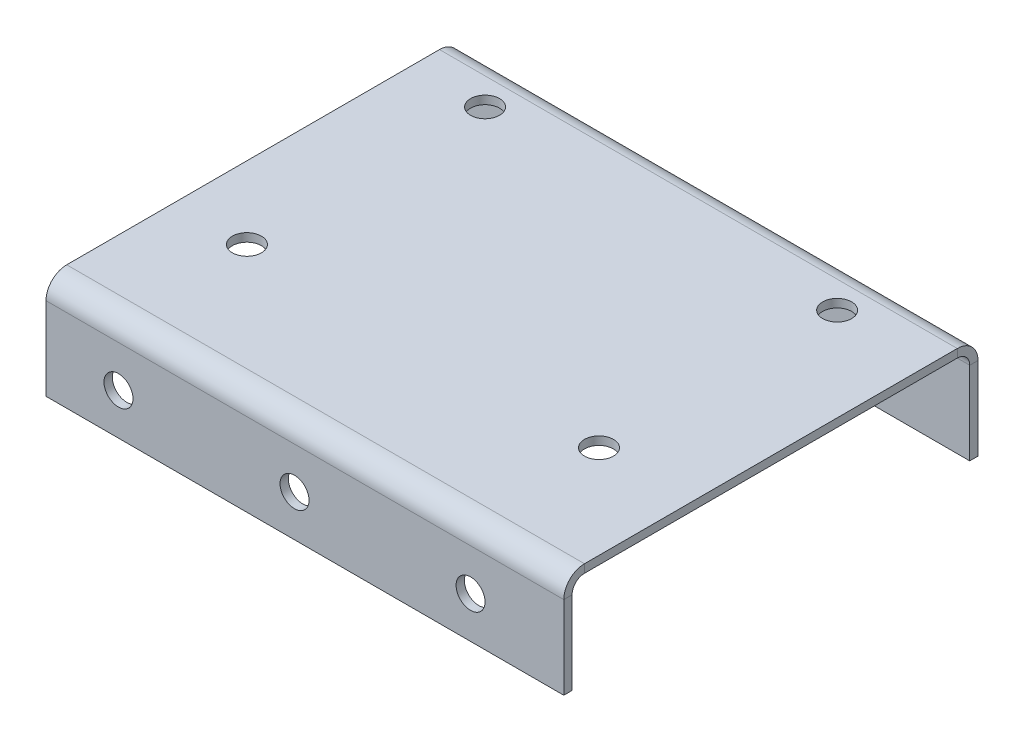
ISO-10303-21;
HEADER;
FILE_DESCRIPTION(('STEP AP214'),'2;1');
FILE_NAME('part.step','',(''),(''),'','','');
FILE_SCHEMA(('AUTOMOTIVE_DESIGN { 1 0 10303 214 1 1 1 1 }'));
ENDSEC;
DATA;
#1=APPLICATION_CONTEXT('core data for automotive mechanical design processes');
#2=APPLICATION_PROTOCOL_DEFINITION('international standard','automotive_design',2000,#1);
#3=PRODUCT_CONTEXT('',#1,'mechanical');
#4=PRODUCT('Part','Part','',(#3));
#5=PRODUCT_RELATED_PRODUCT_CATEGORY('part','',(#4));
#6=PRODUCT_DEFINITION_FORMATION('','',#4);
#7=PRODUCT_DEFINITION_CONTEXT('part definition',#1,'design');
#8=PRODUCT_DEFINITION('design','',#6,#7);
#9=PRODUCT_DEFINITION_SHAPE('','',#8);
#10=(LENGTH_UNIT() NAMED_UNIT(*) SI_UNIT(.MILLI.,.METRE.));
#11=(NAMED_UNIT(*) PLANE_ANGLE_UNIT() SI_UNIT($,.RADIAN.));
#12=(NAMED_UNIT(*) SI_UNIT($,.STERADIAN.) SOLID_ANGLE_UNIT());
#13=UNCERTAINTY_MEASURE_WITH_UNIT(LENGTH_MEASURE(1.E-05),#10,'distance_accuracy_value','');
#14=(GEOMETRIC_REPRESENTATION_CONTEXT(3) GLOBAL_UNCERTAINTY_ASSIGNED_CONTEXT((#13)) GLOBAL_UNIT_ASSIGNED_CONTEXT((#10,
#11,#12)) REPRESENTATION_CONTEXT('',''));
#15=CARTESIAN_POINT('',(0.,0.,0.));
#16=DIRECTION('',(0.,0.,1.));
#17=DIRECTION('',(1.,0.,0.));
#18=AXIS2_PLACEMENT_3D('',#15,#16,#17);
#19=CARTESIAN_POINT('',(125.,86.8114285714285,-10.));
#20=DIRECTION('',(1.,0.,0.));
#21=DIRECTION('',(0.,0.,-1.));
#22=AXIS2_PLACEMENT_3D('',#19,#20,#21);
#23=PLANE('',#22);
#24=DIRECTION('',(0.,-1.,0.));
#25=VECTOR('',#24,1.);
#26=CARTESIAN_POINT('',(125.,86.8114285714285,-10.));
#27=LINE('',#26,#25);
#28=CARTESIAN_POINT('',(125.,86.8114285714285,-10.));
#29=VERTEX_POINT('',#28);
#30=CARTESIAN_POINT('',(125.,82.8114285714285,-10.));
#31=VERTEX_POINT('',#30);
#32=EDGE_CURVE('E11',#29,#31,#27,.T.);
#33=ORIENTED_EDGE('',*,*,#32,.F.);
#34=CARTESIAN_POINT('',(125.,76.8114285714286,-10.));
#35=DIRECTION('',(1.,0.,0.));
#36=DIRECTION('',(0.,0.,-1.));
#37=AXIS2_PLACEMENT_3D('',#34,#35,#36);
#38=CIRCLE('',#37,10.);
#39=CARTESIAN_POINT('',(125.,76.8114285714286,0.));
#40=VERTEX_POINT('',#39);
#41=EDGE_CURVE('E288',#40,#29,#38,.F.);
#42=ORIENTED_EDGE('',*,*,#41,.F.);
#43=DIRECTION('',(0.,0.,1.));
#44=VECTOR('',#43,1.);
#45=CARTESIAN_POINT('',(125.,76.8114285714286,-4.));
#46=LINE('',#45,#44);
#47=CARTESIAN_POINT('',(125.,76.8114285714286,-4.));
#48=VERTEX_POINT('',#47);
#49=EDGE_CURVE('E49',#48,#40,#46,.T.);
#50=ORIENTED_EDGE('',*,*,#49,.F.);
#51=CARTESIAN_POINT('',(125.,76.8114285714286,-10.));
#52=DIRECTION('',(1.,0.,0.));
#53=DIRECTION('',(0.,0.,-1.));
#54=AXIS2_PLACEMENT_3D('',#51,#52,#53);
#55=CIRCLE('',#54,6.);
#56=EDGE_CURVE('E151',#48,#31,#55,.F.);
#57=ORIENTED_EDGE('',*,*,#56,.T.);
#58=EDGE_LOOP('',(#33,#42,#50,#57));
#59=FACE_BOUND('',#58,.T.);
#60=ADVANCED_FACE('F40',(#59),#23,.T.);
#61=CARTESIAN_POINT('',(125.,76.8114285714286,-4.));
#62=DIRECTION('',(1.,0.,0.));
#63=DIRECTION('',(0.,0.,-1.));
#64=AXIS2_PLACEMENT_3D('',#61,#62,#63);
#65=PLANE('',#64);
#66=DIRECTION('',(0.,0.,-1.));
#67=VECTOR('',#66,1.);
#68=CARTESIAN_POINT('',(125.,86.8114285714285,0.));
#69=LINE('',#68,#67);
#70=CARTESIAN_POINT('',(125.,86.8114285714285,-190.));
#71=VERTEX_POINT('',#70);
#72=EDGE_CURVE('E145',#29,#71,#69,.T.);
#73=ORIENTED_EDGE('',*,*,#72,.F.);
#74=ORIENTED_EDGE('',*,*,#32,.T.);
#75=DIRECTION('',(0.,0.,-1.));
#76=VECTOR('',#75,1.);
#77=CARTESIAN_POINT('',(125.,82.8114285714285,0.));
#78=LINE('',#77,#76);
#79=CARTESIAN_POINT('',(125.,82.8114285714286,-190.));
#80=VERTEX_POINT('',#79);
#81=EDGE_CURVE('E142',#31,#80,#78,.T.);
#82=ORIENTED_EDGE('',*,*,#81,.T.);
#83=DIRECTION('',(0.,1.,0.));
#84=VECTOR('',#83,1.);
#85=CARTESIAN_POINT('',(125.,82.8114285714286,-190.));
#86=LINE('',#85,#84);
#87=EDGE_CURVE('E234',#80,#71,#86,.T.);
#88=ORIENTED_EDGE('',*,*,#87,.T.);
#89=EDGE_LOOP('',(#73,#74,#82,#88));
#90=FACE_BOUND('',#89,.T.);
#91=ADVANCED_FACE('F140',(#90),#65,.T.);
#92=CARTESIAN_POINT('',(-125.,76.8114285714286,0.));
#93=DIRECTION('',(-1.,0.,0.));
#94=DIRECTION('',(0.,0.,1.));
#95=AXIS2_PLACEMENT_3D('',#92,#93,#94);
#96=PLANE('',#95);
#97=DIRECTION('',(0.,0.,-1.));
#98=VECTOR('',#97,1.);
#99=CARTESIAN_POINT('',(-125.,76.8114285714286,0.));
#100=LINE('',#99,#98);
#101=CARTESIAN_POINT('',(-125.,76.8114285714286,0.));
#102=VERTEX_POINT('',#101);
#103=CARTESIAN_POINT('',(-125.,76.8114285714286,-4.));
#104=VERTEX_POINT('',#103);
#105=EDGE_CURVE('E239',#102,#104,#100,.T.);
#106=ORIENTED_EDGE('',*,*,#105,.F.);
#107=CARTESIAN_POINT('',(-125.,76.8114285714286,-10.));
#108=DIRECTION('',(1.,0.,0.));
#109=DIRECTION('',(0.,0.,-1.));
#110=AXIS2_PLACEMENT_3D('',#107,#108,#109);
#111=CIRCLE('',#110,10.);
#112=CARTESIAN_POINT('',(-125.,86.8114285714285,-10.));
#113=VERTEX_POINT('',#112);
#114=EDGE_CURVE('E191',#102,#113,#111,.F.);
#115=ORIENTED_EDGE('',*,*,#114,.T.);
#116=DIRECTION('',(0.,1.,0.));
#117=VECTOR('',#116,1.);
#118=CARTESIAN_POINT('',(-125.,82.8114285714285,-10.));
#119=LINE('',#118,#117);
#120=CARTESIAN_POINT('',(-125.,82.8114285714285,-10.));
#121=VERTEX_POINT('',#120);
#122=EDGE_CURVE('E237',#121,#113,#119,.T.);
#123=ORIENTED_EDGE('',*,*,#122,.F.);
#124=CARTESIAN_POINT('',(-125.,76.8114285714286,-10.));
#125=DIRECTION('',(1.,0.,0.));
#126=DIRECTION('',(0.,0.,-1.));
#127=AXIS2_PLACEMENT_3D('',#124,#125,#126);
#128=CIRCLE('',#127,6.);
#129=EDGE_CURVE('E163',#104,#121,#128,.F.);
#130=ORIENTED_EDGE('',*,*,#129,.F.);
#131=EDGE_LOOP('',(#106,#115,#123,#130));
#132=FACE_BOUND('',#131,.T.);
#133=ADVANCED_FACE('F306',(#132),#96,.T.);
#134=CARTESIAN_POINT('',(-125.,82.8114285714285,-10.));
#135=DIRECTION('',(-1.,0.,0.));
#136=DIRECTION('',(0.,0.,1.));
#137=AXIS2_PLACEMENT_3D('',#134,#135,#136);
#138=PLANE('',#137);
#139=DIRECTION('',(0.,1.,0.));
#140=VECTOR('',#139,1.);
#141=CARTESIAN_POINT('',(-125.,36.8114285714285,0.));
#142=LINE('',#141,#140);
#143=CARTESIAN_POINT('',(-125.,36.8114285714285,0.));
#144=VERTEX_POINT('',#143);
#145=EDGE_CURVE('E194',#144,#102,#142,.T.);
#146=ORIENTED_EDGE('',*,*,#145,.T.);
#147=ORIENTED_EDGE('',*,*,#105,.T.);
#148=DIRECTION('',(0.,1.,0.));
#149=VECTOR('',#148,1.);
#150=CARTESIAN_POINT('',(-125.,36.8114285714285,-4.));
#151=LINE('',#150,#149);
#152=CARTESIAN_POINT('',(-125.,36.8114285714285,-4.));
#153=VERTEX_POINT('',#152);
#154=EDGE_CURVE('E200',#153,#104,#151,.T.);
#155=ORIENTED_EDGE('',*,*,#154,.F.);
#156=DIRECTION('',(0.,0.,1.));
#157=VECTOR('',#156,1.);
#158=CARTESIAN_POINT('',(-125.,36.8114285714285,-4.));
#159=LINE('',#158,#157);
#160=EDGE_CURVE('E197',#153,#144,#159,.T.);
#161=ORIENTED_EDGE('',*,*,#160,.T.);
#162=EDGE_LOOP('',(#146,#147,#155,#161));
#163=FACE_BOUND('',#162,.T.);
#164=ADVANCED_FACE('F351',(#163),#138,.T.);
#165=CARTESIAN_POINT('',(125.,76.8114285714286,-200.));
#166=DIRECTION('',(1.,0.,0.));
#167=DIRECTION('',(0.,0.,-1.));
#168=AXIS2_PLACEMENT_3D('',#165,#166,#167);
#169=PLANE('',#168);
#170=DIRECTION('',(0.,0.,1.));
#171=VECTOR('',#170,1.);
#172=CARTESIAN_POINT('',(125.,76.8114285714286,-200.));
#173=LINE('',#172,#171);
#174=CARTESIAN_POINT('',(125.,76.8114285714286,-200.));
#175=VERTEX_POINT('',#174);
#176=CARTESIAN_POINT('',(125.,76.8114285714286,-196.));
#177=VERTEX_POINT('',#176);
#178=EDGE_CURVE('E58',#175,#177,#173,.T.);
#179=ORIENTED_EDGE('',*,*,#178,.F.);
#180=CARTESIAN_POINT('',(125.,76.8114285714286,-190.));
#181=DIRECTION('',(1.,0.,0.));
#182=DIRECTION('',(0.,0.,-1.));
#183=AXIS2_PLACEMENT_3D('',#180,#181,#182);
#184=CIRCLE('',#183,10.);
#185=EDGE_CURVE('E284',#71,#175,#184,.F.);
#186=ORIENTED_EDGE('',*,*,#185,.F.);
#187=ORIENTED_EDGE('',*,*,#87,.F.);
#188=CARTESIAN_POINT('',(125.,76.8114285714286,-190.));
#189=DIRECTION('',(1.,0.,0.));
#190=DIRECTION('',(0.,0.,-1.));
#191=AXIS2_PLACEMENT_3D('',#188,#189,#190);
#192=CIRCLE('',#191,6.);
#193=EDGE_CURVE('E171',#80,#177,#192,.F.);
#194=ORIENTED_EDGE('',*,*,#193,.T.);
#195=EDGE_LOOP('',(#179,#186,#187,#194));
#196=FACE_BOUND('',#195,.T.);
#197=ADVANCED_FACE('F356',(#196),#169,.T.);
#198=CARTESIAN_POINT('',(125.,82.8114285714286,-190.));
#199=DIRECTION('',(1.,0.,0.));
#200=DIRECTION('',(0.,0.,-1.));
#201=AXIS2_PLACEMENT_3D('',#198,#199,#200);
#202=PLANE('',#201);
#203=DIRECTION('',(0.,-1.,0.));
#204=VECTOR('',#203,1.);
#205=CARTESIAN_POINT('',(125.,86.8114285714285,-200.));
#206=LINE('',#205,#204);
#207=CARTESIAN_POINT('',(125.,36.8114285714285,-200.));
#208=VERTEX_POINT('',#207);
#209=EDGE_CURVE('E281',#175,#208,#206,.T.);
#210=ORIENTED_EDGE('',*,*,#209,.F.);
#211=ORIENTED_EDGE('',*,*,#178,.T.);
#212=DIRECTION('',(0.,1.,0.));
#213=VECTOR('',#212,1.);
#214=CARTESIAN_POINT('',(125.,86.8114285714285,-196.));
#215=LINE('',#214,#213);
#216=CARTESIAN_POINT('',(125.,36.8114285714285,-196.));
#217=VERTEX_POINT('',#216);
#218=EDGE_CURVE('E112',#177,#217,#215,.F.);
#219=ORIENTED_EDGE('',*,*,#218,.T.);
#220=DIRECTION('',(0.,0.,1.));
#221=VECTOR('',#220,1.);
#222=CARTESIAN_POINT('',(125.,36.8114285714285,-200.));
#223=LINE('',#222,#221);
#224=EDGE_CURVE('E278',#208,#217,#223,.T.);
#225=ORIENTED_EDGE('',*,*,#224,.F.);
#226=EDGE_LOOP('',(#210,#211,#219,#225));
#227=FACE_BOUND('',#226,.T.);
#228=ADVANCED_FACE('F333',(#227),#202,.T.);
#229=CARTESIAN_POINT('',(-125.,86.8114285714285,-190.));
#230=DIRECTION('',(-1.,0.,0.));
#231=DIRECTION('',(0.,0.,1.));
#232=AXIS2_PLACEMENT_3D('',#229,#230,#231);
#233=PLANE('',#232);
#234=DIRECTION('',(0.,-1.,0.));
#235=VECTOR('',#234,1.);
#236=CARTESIAN_POINT('',(-125.,86.8114285714285,-190.));
#237=LINE('',#236,#235);
#238=CARTESIAN_POINT('',(-125.,86.8114285714285,-190.));
#239=VERTEX_POINT('',#238);
#240=CARTESIAN_POINT('',(-125.,82.8114285714286,-190.));
#241=VERTEX_POINT('',#240);
#242=EDGE_CURVE('E99',#239,#241,#237,.T.);
#243=ORIENTED_EDGE('',*,*,#242,.F.);
#244=CARTESIAN_POINT('',(-125.,76.8114285714286,-190.));
#245=DIRECTION('',(1.,0.,0.));
#246=DIRECTION('',(0.,0.,-1.));
#247=AXIS2_PLACEMENT_3D('',#244,#245,#246);
#248=CIRCLE('',#247,10.);
#249=CARTESIAN_POINT('',(-125.,76.8114285714286,-200.));
#250=VERTEX_POINT('',#249);
#251=EDGE_CURVE('E187',#239,#250,#248,.F.);
#252=ORIENTED_EDGE('',*,*,#251,.T.);
#253=DIRECTION('',(0.,0.,-1.));
#254=VECTOR('',#253,1.);
#255=CARTESIAN_POINT('',(-125.,76.8114285714286,-196.));
#256=LINE('',#255,#254);
#257=CARTESIAN_POINT('',(-125.,76.8114285714286,-196.));
#258=VERTEX_POINT('',#257);
#259=EDGE_CURVE('E106',#258,#250,#256,.T.);
#260=ORIENTED_EDGE('',*,*,#259,.F.);
#261=CARTESIAN_POINT('',(-125.,76.8114285714286,-190.));
#262=DIRECTION('',(1.,0.,0.));
#263=DIRECTION('',(0.,0.,-1.));
#264=AXIS2_PLACEMENT_3D('',#261,#262,#263);
#265=CIRCLE('',#264,6.);
#266=EDGE_CURVE('E206',#241,#258,#265,.F.);
#267=ORIENTED_EDGE('',*,*,#266,.F.);
#268=EDGE_LOOP('',(#243,#252,#260,#267));
#269=FACE_BOUND('',#268,.T.);
#270=ADVANCED_FACE('F321',(#269),#233,.T.);
#271=CARTESIAN_POINT('',(-125.,76.8114285714286,-196.));
#272=DIRECTION('',(-1.,0.,0.));
#273=DIRECTION('',(0.,0.,1.));
#274=AXIS2_PLACEMENT_3D('',#271,#272,#273);
#275=PLANE('',#274);
#276=DIRECTION('',(0.,0.,-1.));
#277=VECTOR('',#276,1.);
#278=CARTESIAN_POINT('',(-125.,86.8114285714285,0.));
#279=LINE('',#278,#277);
#280=EDGE_CURVE('E189',#113,#239,#279,.T.);
#281=ORIENTED_EDGE('',*,*,#280,.T.);
#282=ORIENTED_EDGE('',*,*,#242,.T.);
#283=DIRECTION('',(0.,0.,-1.));
#284=VECTOR('',#283,1.);
#285=CARTESIAN_POINT('',(-125.,82.8114285714285,0.));
#286=LINE('',#285,#284);
#287=EDGE_CURVE('E204',#121,#241,#286,.T.);
#288=ORIENTED_EDGE('',*,*,#287,.F.);
#289=ORIENTED_EDGE('',*,*,#122,.T.);
#290=EDGE_LOOP('',(#281,#282,#288,#289));
#291=FACE_BOUND('',#290,.T.);
#292=ADVANCED_FACE('F308',(#291),#275,.T.);
#293=CARTESIAN_POINT('',(125.,86.8114285714285,-196.));
#294=DIRECTION('',(0.,0.,-1.));
#295=DIRECTION('',(-1.,0.,0.));
#296=AXIS2_PLACEMENT_3D('',#293,#294,#295);
#297=PLANE('',#296);
#298=DIRECTION('',(0.,1.,0.));
#299=VECTOR('',#298,1.);
#300=CARTESIAN_POINT('',(-125.,86.8114285714285,-196.));
#301=LINE('',#300,#299);
#302=CARTESIAN_POINT('',(-125.,36.8114285714285,-196.));
#303=VERTEX_POINT('',#302);
#304=EDGE_CURVE('E177',#258,#303,#301,.F.);
#305=ORIENTED_EDGE('',*,*,#304,.T.);
#306=DIRECTION('',(-1.,0.,0.));
#307=VECTOR('',#306,1.);
#308=CARTESIAN_POINT('',(125.,36.8114285714285,-196.));
#309=LINE('',#308,#307);
#310=EDGE_CURVE('E230',#217,#303,#309,.T.);
#311=ORIENTED_EDGE('',*,*,#310,.F.);
#312=ORIENTED_EDGE('',*,*,#218,.F.);
#313=DIRECTION('',(-1.,0.,0.));
#314=VECTOR('',#313,1.);
#315=CARTESIAN_POINT('',(125.,76.8114285714286,-196.));
#316=LINE('',#315,#314);
#317=EDGE_CURVE('E173',#177,#258,#316,.T.);
#318=ORIENTED_EDGE('',*,*,#317,.T.);
#319=EDGE_LOOP('',(#305,#311,#312,#318));
#320=FACE_BOUND('',#319,.T.);
#321=ADVANCED_FACE('F327',(#320),#297,.F.);
#322=CARTESIAN_POINT('',(125.,36.8114285714285,-200.));
#323=DIRECTION('',(0.,-1.,0.));
#324=DIRECTION('',(0.,0.,-1.));
#325=AXIS2_PLACEMENT_3D('',#322,#323,#324);
#326=PLANE('',#325);
#327=DIRECTION('',(0.,0.,1.));
#328=VECTOR('',#327,1.);
#329=CARTESIAN_POINT('',(-125.,36.8114285714285,-200.));
#330=LINE('',#329,#328);
#331=CARTESIAN_POINT('',(-125.,36.8114285714285,-200.));
#332=VERTEX_POINT('',#331);
#333=EDGE_CURVE('E180',#332,#303,#330,.T.);
#334=ORIENTED_EDGE('',*,*,#333,.F.);
#335=DIRECTION('',(-1.,0.,0.));
#336=VECTOR('',#335,1.);
#337=CARTESIAN_POINT('',(125.,36.8114285714285,-200.));
#338=LINE('',#337,#336);
#339=EDGE_CURVE('E228',#208,#332,#338,.T.);
#340=ORIENTED_EDGE('',*,*,#339,.F.);
#341=ORIENTED_EDGE('',*,*,#224,.T.);
#342=ORIENTED_EDGE('',*,*,#310,.T.);
#343=EDGE_LOOP('',(#334,#340,#341,#342));
#344=FACE_BOUND('',#343,.T.);
#345=ADVANCED_FACE('F332',(#344),#326,.T.);
#346=CARTESIAN_POINT('',(125.,86.8114285714285,-200.));
#347=DIRECTION('',(0.,0.,-1.));
#348=DIRECTION('',(-1.,0.,0.));
#349=AXIS2_PLACEMENT_3D('',#346,#347,#348);
#350=PLANE('',#349);
#351=DIRECTION('',(0.,-1.,0.));
#352=VECTOR('',#351,1.);
#353=CARTESIAN_POINT('',(-125.,86.8114285714285,-200.));
#354=LINE('',#353,#352);
#355=EDGE_CURVE('E184',#250,#332,#354,.T.);
#356=ORIENTED_EDGE('',*,*,#355,.F.);
#357=DIRECTION('',(-1.,0.,0.));
#358=VECTOR('',#357,1.);
#359=CARTESIAN_POINT('',(125.,76.8114285714286,-200.));
#360=LINE('',#359,#358);
#361=EDGE_CURVE('E225',#175,#250,#360,.T.);
#362=ORIENTED_EDGE('',*,*,#361,.F.);
#363=ORIENTED_EDGE('',*,*,#209,.T.);
#364=ORIENTED_EDGE('',*,*,#339,.T.);
#365=EDGE_LOOP('',(#356,#362,#363,#364));
#366=FACE_BOUND('',#365,.T.);
#367=ADVANCED_FACE('F335',(#366),#350,.T.);
#368=CARTESIAN_POINT('',(125.,76.8114285714286,-190.));
#369=DIRECTION('',(-1.,0.,0.));
#370=DIRECTION('',(0.,0.,1.));
#371=AXIS2_PLACEMENT_3D('',#368,#369,#370);
#372=CYLINDRICAL_SURFACE('',#371,10.);
#373=ORIENTED_EDGE('',*,*,#251,.F.);
#374=DIRECTION('',(-1.,0.,0.));
#375=VECTOR('',#374,1.);
#376=CARTESIAN_POINT('',(125.,86.8114285714285,-190.));
#377=LINE('',#376,#375);
#378=EDGE_CURVE('E222',#71,#239,#377,.T.);
#379=ORIENTED_EDGE('',*,*,#378,.F.);
#380=ORIENTED_EDGE('',*,*,#185,.T.);
#381=ORIENTED_EDGE('',*,*,#361,.T.);
#382=EDGE_LOOP('',(#373,#379,#380,#381));
#383=FACE_BOUND('',#382,.T.);
#384=ADVANCED_FACE('F318',(#383),#372,.T.);
#385=CARTESIAN_POINT('',(125.,86.8114285714285,0.));
#386=DIRECTION('',(0.,1.,0.));
#387=DIRECTION('',(0.,0.,1.));
#388=AXIS2_PLACEMENT_3D('',#385,#386,#387);
#389=PLANE('',#388);
#390=CARTESIAN_POINT('',(-90.,86.8114285714285,-62.));
#391=DIRECTION('',(0.,1.,0.));
#392=DIRECTION('',(0.,0.,1.));
#393=AXIS2_PLACEMENT_3D('',#390,#391,#392);
#394=CIRCLE('',#393,7.);
#395=CARTESIAN_POINT('',(-90.,86.8114285714285,-55.));
#396=VERTEX_POINT('',#395);
#397=EDGE_CURVE('E262',#396,#396,#394,.T.);
#398=ORIENTED_EDGE('',*,*,#397,.F.);
#399=EDGE_LOOP('',(#398));
#400=FACE_BOUND('',#399,.T.);
#401=CARTESIAN_POINT('',(80.,86.8114285714285,-62.));
#402=DIRECTION('',(0.,1.,0.));
#403=DIRECTION('',(0.,0.,1.));
#404=AXIS2_PLACEMENT_3D('',#401,#402,#403);
#405=CIRCLE('',#404,7.);
#406=CARTESIAN_POINT('',(80.,86.8114285714285,-55.));
#407=VERTEX_POINT('',#406);
#408=EDGE_CURVE('E266',#407,#407,#405,.T.);
#409=ORIENTED_EDGE('',*,*,#408,.F.);
#410=EDGE_LOOP('',(#409));
#411=FACE_BOUND('',#410,.T.);
#412=CARTESIAN_POINT('',(80.,86.8114285714285,-177.));
#413=DIRECTION('',(0.,1.,0.));
#414=DIRECTION('',(0.,0.,1.));
#415=AXIS2_PLACEMENT_3D('',#412,#413,#414);
#416=CIRCLE('',#415,7.);
#417=CARTESIAN_POINT('',(80.,86.8114285714285,-170.));
#418=VERTEX_POINT('',#417);
#419=EDGE_CURVE('E271',#418,#418,#416,.T.);
#420=ORIENTED_EDGE('',*,*,#419,.F.);
#421=EDGE_LOOP('',(#420));
#422=FACE_BOUND('',#421,.T.);
#423=CARTESIAN_POINT('',(-90.,86.8114285714285,-177.));
#424=DIRECTION('',(0.,1.,0.));
#425=DIRECTION('',(0.,0.,1.));
#426=AXIS2_PLACEMENT_3D('',#423,#424,#425);
#427=CIRCLE('',#426,7.);
#428=CARTESIAN_POINT('',(-90.,86.8114285714285,-170.));
#429=VERTEX_POINT('',#428);
#430=EDGE_CURVE('E246',#429,#429,#427,.T.);
#431=ORIENTED_EDGE('',*,*,#430,.F.);
#432=EDGE_LOOP('',(#431));
#433=FACE_BOUND('',#432,.T.);
#434=ORIENTED_EDGE('',*,*,#280,.F.);
#435=DIRECTION('',(-1.,0.,0.));
#436=VECTOR('',#435,1.);
#437=CARTESIAN_POINT('',(125.,86.8114285714285,-10.));
#438=LINE('',#437,#436);
#439=EDGE_CURVE('E219',#29,#113,#438,.T.);
#440=ORIENTED_EDGE('',*,*,#439,.F.);
#441=ORIENTED_EDGE('',*,*,#72,.T.);
#442=ORIENTED_EDGE('',*,*,#378,.T.);
#443=EDGE_LOOP('',(#434,#440,#441,#442));
#444=FACE_BOUND('',#443,.T.);
#445=ADVANCED_FACE('F313',(#400,#411,#422,#433,#444),#389,.T.);
#446=CARTESIAN_POINT('',(125.,76.8114285714286,-10.));
#447=DIRECTION('',(-1.,0.,0.));
#448=DIRECTION('',(0.,0.,1.));
#449=AXIS2_PLACEMENT_3D('',#446,#447,#448);
#450=CYLINDRICAL_SURFACE('',#449,10.);
#451=ORIENTED_EDGE('',*,*,#114,.F.);
#452=DIRECTION('',(-1.,0.,0.));
#453=VECTOR('',#452,1.);
#454=CARTESIAN_POINT('',(125.,76.8114285714286,0.));
#455=LINE('',#454,#453);
#456=EDGE_CURVE('E216',#40,#102,#455,.T.);
#457=ORIENTED_EDGE('',*,*,#456,.F.);
#458=ORIENTED_EDGE('',*,*,#41,.T.);
#459=ORIENTED_EDGE('',*,*,#439,.T.);
#460=EDGE_LOOP('',(#451,#457,#458,#459));
#461=FACE_BOUND('',#460,.T.);
#462=ADVANCED_FACE('F311',(#461),#450,.T.);
#463=CARTESIAN_POINT('',(125.,36.8114285714285,0.));
#464=DIRECTION('',(0.,0.,1.));
#465=DIRECTION('',(1.,0.,0.));
#466=AXIS2_PLACEMENT_3D('',#463,#464,#465);
#467=PLANE('',#466);
#468=CARTESIAN_POINT('',(-90.,56.8114285714285,0.));
#469=DIRECTION('',(0.,0.,1.));
#470=DIRECTION('',(1.,0.,0.));
#471=AXIS2_PLACEMENT_3D('',#468,#469,#470);
#472=CIRCLE('',#471,7.);
#473=CARTESIAN_POINT('',(-83.,56.8114285714285,0.));
#474=VERTEX_POINT('',#473);
#475=EDGE_CURVE('E257',#474,#474,#472,.T.);
#476=ORIENTED_EDGE('',*,*,#475,.F.);
#477=EDGE_LOOP('',(#476));
#478=FACE_BOUND('',#477,.T.);
#479=CARTESIAN_POINT('',(-4.99999999999999,56.8114285714285,0.));
#480=DIRECTION('',(0.,0.,1.));
#481=DIRECTION('',(1.,0.,0.));
#482=AXIS2_PLACEMENT_3D('',#479,#480,#481);
#483=CIRCLE('',#482,7.);
#484=CARTESIAN_POINT('',(2.00000000000001,56.8114285714285,0.));
#485=VERTEX_POINT('',#484);
#486=EDGE_CURVE('E650',#485,#485,#483,.T.);
#487=ORIENTED_EDGE('',*,*,#486,.F.);
#488=EDGE_LOOP('',(#487));
#489=FACE_BOUND('',#488,.T.);
#490=CARTESIAN_POINT('',(80.,56.8114285714285,0.));
#491=DIRECTION('',(0.,0.,1.));
#492=DIRECTION('',(1.,0.,0.));
#493=AXIS2_PLACEMENT_3D('',#490,#491,#492);
#494=CIRCLE('',#493,7.);
#495=CARTESIAN_POINT('',(87.,56.8114285714285,0.));
#496=VERTEX_POINT('',#495);
#497=EDGE_CURVE('E653',#496,#496,#494,.T.);
#498=ORIENTED_EDGE('',*,*,#497,.F.);
#499=EDGE_LOOP('',(#498));
#500=FACE_BOUND('',#499,.T.);
#501=ORIENTED_EDGE('',*,*,#145,.F.);
#502=DIRECTION('',(-1.,0.,0.));
#503=VECTOR('',#502,1.);
#504=CARTESIAN_POINT('',(125.,36.8114285714285,0.));
#505=LINE('',#504,#503);
#506=CARTESIAN_POINT('',(125.,36.8114285714285,0.));
#507=VERTEX_POINT('',#506);
#508=EDGE_CURVE('E214',#507,#144,#505,.T.);
#509=ORIENTED_EDGE('',*,*,#508,.F.);
#510=DIRECTION('',(0.,1.,0.));
#511=VECTOR('',#510,1.);
#512=CARTESIAN_POINT('',(125.,36.8114285714285,0.));
#513=LINE('',#512,#511);
#514=EDGE_CURVE('E290',#507,#40,#513,.T.);
#515=ORIENTED_EDGE('',*,*,#514,.T.);
#516=ORIENTED_EDGE('',*,*,#456,.T.);
#517=EDGE_LOOP('',(#501,#509,#515,#516));
#518=FACE_BOUND('',#517,.T.);
#519=ADVANCED_FACE('F400',(#478,#489,#500,#518),#467,.T.);
#520=CARTESIAN_POINT('',(125.,36.8114285714285,-4.));
#521=DIRECTION('',(0.,-1.,0.));
#522=DIRECTION('',(0.,0.,-1.));
#523=AXIS2_PLACEMENT_3D('',#520,#521,#522);
#524=PLANE('',#523);
#525=ORIENTED_EDGE('',*,*,#160,.F.);
#526=DIRECTION('',(-1.,0.,0.));
#527=VECTOR('',#526,1.);
#528=CARTESIAN_POINT('',(125.,36.8114285714285,-4.));
#529=LINE('',#528,#527);
#530=CARTESIAN_POINT('',(125.,36.8114285714285,-4.));
#531=VERTEX_POINT('',#530);
#532=EDGE_CURVE('E212',#531,#153,#529,.T.);
#533=ORIENTED_EDGE('',*,*,#532,.F.);
#534=DIRECTION('',(0.,0.,1.));
#535=VECTOR('',#534,1.);
#536=CARTESIAN_POINT('',(125.,36.8114285714285,-4.));
#537=LINE('',#536,#535);
#538=EDGE_CURVE('E293',#531,#507,#537,.T.);
#539=ORIENTED_EDGE('',*,*,#538,.T.);
#540=ORIENTED_EDGE('',*,*,#508,.T.);
#541=EDGE_LOOP('',(#525,#533,#539,#540));
#542=FACE_BOUND('',#541,.T.);
#543=ADVANCED_FACE('F408',(#542),#524,.T.);
#544=CARTESIAN_POINT('',(125.,36.8114285714285,-4.));
#545=DIRECTION('',(0.,0.,1.));
#546=DIRECTION('',(1.,0.,0.));
#547=AXIS2_PLACEMENT_3D('',#544,#545,#546);
#548=PLANE('',#547);
#549=CARTESIAN_POINT('',(-90.,56.8114285714285,-4.));
#550=DIRECTION('',(0.,0.,1.));
#551=DIRECTION('',(1.,0.,0.));
#552=AXIS2_PLACEMENT_3D('',#549,#550,#551);
#553=CIRCLE('',#552,7.);
#554=CARTESIAN_POINT('',(-83.,56.8114285714285,-4.));
#555=VERTEX_POINT('',#554);
#556=EDGE_CURVE('E43',#555,#555,#553,.T.);
#557=ORIENTED_EDGE('',*,*,#556,.T.);
#558=EDGE_LOOP('',(#557));
#559=FACE_BOUND('',#558,.T.);
#560=CARTESIAN_POINT('',(-4.99999999999999,56.8114285714285,-4.));
#561=DIRECTION('',(0.,0.,1.));
#562=DIRECTION('',(1.,0.,0.));
#563=AXIS2_PLACEMENT_3D('',#560,#561,#562);
#564=CIRCLE('',#563,7.);
#565=CARTESIAN_POINT('',(2.00000000000001,56.8114285714285,-4.));
#566=VERTEX_POINT('',#565);
#567=EDGE_CURVE('E256',#566,#566,#564,.T.);
#568=ORIENTED_EDGE('',*,*,#567,.T.);
#569=EDGE_LOOP('',(#568));
#570=FACE_BOUND('',#569,.T.);
#571=CARTESIAN_POINT('',(80.,56.8114285714285,-4.));
#572=DIRECTION('',(0.,0.,1.));
#573=DIRECTION('',(1.,0.,0.));
#574=AXIS2_PLACEMENT_3D('',#571,#572,#573);
#575=CIRCLE('',#574,7.);
#576=CARTESIAN_POINT('',(87.,56.8114285714285,-4.));
#577=VERTEX_POINT('',#576);
#578=EDGE_CURVE('E254',#577,#577,#575,.T.);
#579=ORIENTED_EDGE('',*,*,#578,.T.);
#580=EDGE_LOOP('',(#579));
#581=FACE_BOUND('',#580,.T.);
#582=ORIENTED_EDGE('',*,*,#154,.T.);
#583=DIRECTION('',(-1.,0.,0.));
#584=VECTOR('',#583,1.);
#585=CARTESIAN_POINT('',(125.,76.8114285714286,-4.));
#586=LINE('',#585,#584);
#587=EDGE_CURVE('E165',#48,#104,#586,.T.);
#588=ORIENTED_EDGE('',*,*,#587,.F.);
#589=DIRECTION('',(0.,1.,0.));
#590=VECTOR('',#589,1.);
#591=CARTESIAN_POINT('',(125.,36.8114285714285,-4.));
#592=LINE('',#591,#590);
#593=EDGE_CURVE('E156',#531,#48,#592,.T.);
#594=ORIENTED_EDGE('',*,*,#593,.F.);
#595=ORIENTED_EDGE('',*,*,#532,.T.);
#596=EDGE_LOOP('',(#582,#588,#594,#595));
#597=FACE_BOUND('',#596,.T.);
#598=ADVANCED_FACE('F303',(#559,#570,#581,#597),#548,.F.);
#599=CARTESIAN_POINT('',(125.,76.8114285714286,-10.));
#600=DIRECTION('',(-1.,0.,0.));
#601=DIRECTION('',(0.,0.,1.));
#602=AXIS2_PLACEMENT_3D('',#599,#600,#601);
#603=CYLINDRICAL_SURFACE('',#602,6.);
#604=ORIENTED_EDGE('',*,*,#129,.T.);
#605=DIRECTION('',(-1.,0.,0.));
#606=VECTOR('',#605,1.);
#607=CARTESIAN_POINT('',(125.,82.8114285714285,-10.));
#608=LINE('',#607,#606);
#609=EDGE_CURVE('E160',#31,#121,#608,.T.);
#610=ORIENTED_EDGE('',*,*,#609,.F.);
#611=ORIENTED_EDGE('',*,*,#56,.F.);
#612=ORIENTED_EDGE('',*,*,#587,.T.);
#613=EDGE_LOOP('',(#604,#610,#611,#612));
#614=FACE_BOUND('',#613,.T.);
#615=ADVANCED_FACE('F161',(#614),#603,.F.);
#616=CARTESIAN_POINT('',(125.,82.8114285714285,0.));
#617=DIRECTION('',(0.,1.,0.));
#618=DIRECTION('',(0.,0.,1.));
#619=AXIS2_PLACEMENT_3D('',#616,#617,#618);
#620=PLANE('',#619);
#621=CARTESIAN_POINT('',(-90.,82.8114285714285,-62.));
#622=DIRECTION('',(0.,1.,0.));
#623=DIRECTION('',(0.,0.,1.));
#624=AXIS2_PLACEMENT_3D('',#621,#622,#623);
#625=CIRCLE('',#624,7.);
#626=CARTESIAN_POINT('',(-90.,82.8114285714285,-55.));
#627=VERTEX_POINT('',#626);
#628=EDGE_CURVE('E181',#627,#627,#625,.T.);
#629=ORIENTED_EDGE('',*,*,#628,.T.);
#630=EDGE_LOOP('',(#629));
#631=FACE_BOUND('',#630,.T.);
#632=CARTESIAN_POINT('',(80.,82.8114285714285,-62.));
#633=DIRECTION('',(0.,1.,0.));
#634=DIRECTION('',(0.,0.,1.));
#635=AXIS2_PLACEMENT_3D('',#632,#633,#634);
#636=CIRCLE('',#635,7.);
#637=CARTESIAN_POINT('',(80.,82.8114285714285,-55.));
#638=VERTEX_POINT('',#637);
#639=EDGE_CURVE('E249',#638,#638,#636,.T.);
#640=ORIENTED_EDGE('',*,*,#639,.T.);
#641=EDGE_LOOP('',(#640));
#642=FACE_BOUND('',#641,.T.);
#643=CARTESIAN_POINT('',(80.,82.8114285714285,-177.));
#644=DIRECTION('',(0.,1.,0.));
#645=DIRECTION('',(0.,0.,1.));
#646=AXIS2_PLACEMENT_3D('',#643,#644,#645);
#647=CIRCLE('',#646,7.);
#648=CARTESIAN_POINT('',(80.,82.8114285714285,-170.));
#649=VERTEX_POINT('',#648);
#650=EDGE_CURVE('E245',#649,#649,#647,.T.);
#651=ORIENTED_EDGE('',*,*,#650,.T.);
#652=EDGE_LOOP('',(#651));
#653=FACE_BOUND('',#652,.T.);
#654=CARTESIAN_POINT('',(-90.,82.8114285714285,-177.));
#655=DIRECTION('',(0.,1.,0.));
#656=DIRECTION('',(0.,0.,1.));
#657=AXIS2_PLACEMENT_3D('',#654,#655,#656);
#658=CIRCLE('',#657,7.);
#659=CARTESIAN_POINT('',(-90.,82.8114285714285,-170.));
#660=VERTEX_POINT('',#659);
#661=EDGE_CURVE('E242',#660,#660,#658,.T.);
#662=ORIENTED_EDGE('',*,*,#661,.T.);
#663=EDGE_LOOP('',(#662));
#664=FACE_BOUND('',#663,.T.);
#665=ORIENTED_EDGE('',*,*,#287,.T.);
#666=DIRECTION('',(-1.,0.,0.));
#667=VECTOR('',#666,1.);
#668=CARTESIAN_POINT('',(125.,82.8114285714286,-190.));
#669=LINE('',#668,#667);
#670=EDGE_CURVE('E166',#80,#241,#669,.T.);
#671=ORIENTED_EDGE('',*,*,#670,.F.);
#672=ORIENTED_EDGE('',*,*,#81,.F.);
#673=ORIENTED_EDGE('',*,*,#609,.T.);
#674=EDGE_LOOP('',(#665,#671,#672,#673));
#675=FACE_BOUND('',#674,.T.);
#676=ADVANCED_FACE('F168',(#631,#642,#653,#664,#675),#620,.F.);
#677=CARTESIAN_POINT('',(125.,76.8114285714286,-190.));
#678=DIRECTION('',(-1.,0.,0.));
#679=DIRECTION('',(0.,0.,1.));
#680=AXIS2_PLACEMENT_3D('',#677,#678,#679);
#681=CYLINDRICAL_SURFACE('',#680,6.);
#682=ORIENTED_EDGE('',*,*,#266,.T.);
#683=ORIENTED_EDGE('',*,*,#317,.F.);
#684=ORIENTED_EDGE('',*,*,#193,.F.);
#685=ORIENTED_EDGE('',*,*,#670,.T.);
#686=EDGE_LOOP('',(#682,#683,#684,#685));
#687=FACE_BOUND('',#686,.T.);
#688=ADVANCED_FACE('F324',(#687),#681,.F.);
#689=CARTESIAN_POINT('',(125.,76.8114285714286,-190.));
#690=DIRECTION('',(1.,0.,0.));
#691=DIRECTION('',(0.,0.,-1.));
#692=AXIS2_PLACEMENT_3D('',#689,#690,#691);
#693=PLANE('',#692);
#694=ORIENTED_EDGE('',*,*,#593,.T.);
#695=ORIENTED_EDGE('',*,*,#49,.T.);
#696=ORIENTED_EDGE('',*,*,#514,.F.);
#697=ORIENTED_EDGE('',*,*,#538,.F.);
#698=EDGE_LOOP('',(#694,#695,#696,#697));
#699=FACE_BOUND('',#698,.T.);
#700=ADVANCED_FACE('F299',(#699),#693,.T.);
#701=CARTESIAN_POINT('',(-125.,76.8114285714286,-190.));
#702=DIRECTION('',(1.,0.,0.));
#703=DIRECTION('',(0.,0.,-1.));
#704=AXIS2_PLACEMENT_3D('',#701,#702,#703);
#705=PLANE('',#704);
#706=ORIENTED_EDGE('',*,*,#304,.F.);
#707=ORIENTED_EDGE('',*,*,#259,.T.);
#708=ORIENTED_EDGE('',*,*,#355,.T.);
#709=ORIENTED_EDGE('',*,*,#333,.T.);
#710=EDGE_LOOP('',(#706,#707,#708,#709));
#711=FACE_BOUND('',#710,.T.);
#712=ADVANCED_FACE('F329',(#711),#705,.F.);
#713=CARTESIAN_POINT('',(-90.,76.8114285714286,-177.));
#714=DIRECTION('',(0.,1.,0.));
#715=DIRECTION('',(0.,0.,1.));
#716=AXIS2_PLACEMENT_3D('',#713,#714,#715);
#717=CYLINDRICAL_SURFACE('',#716,7.);
#718=ORIENTED_EDGE('',*,*,#430,.T.);
#719=EDGE_LOOP('',(#718));
#720=FACE_BOUND('',#719,.T.);
#721=ORIENTED_EDGE('',*,*,#661,.F.);
#722=EDGE_LOOP('',(#721));
#723=FACE_BOUND('',#722,.T.);
#724=ADVANCED_FACE('F454',(#720,#723),#717,.F.);
#725=CARTESIAN_POINT('',(80.,76.8114285714286,-177.));
#726=DIRECTION('',(0.,1.,0.));
#727=DIRECTION('',(0.,0.,1.));
#728=AXIS2_PLACEMENT_3D('',#725,#726,#727);
#729=CYLINDRICAL_SURFACE('',#728,7.);
#730=ORIENTED_EDGE('',*,*,#419,.T.);
#731=EDGE_LOOP('',(#730));
#732=FACE_BOUND('',#731,.T.);
#733=ORIENTED_EDGE('',*,*,#650,.F.);
#734=EDGE_LOOP('',(#733));
#735=FACE_BOUND('',#734,.T.);
#736=ADVANCED_FACE('F480',(#732,#735),#729,.F.);
#737=CARTESIAN_POINT('',(80.,76.8114285714286,-62.));
#738=DIRECTION('',(0.,1.,0.));
#739=DIRECTION('',(0.,0.,1.));
#740=AXIS2_PLACEMENT_3D('',#737,#738,#739);
#741=CYLINDRICAL_SURFACE('',#740,7.);
#742=ORIENTED_EDGE('',*,*,#408,.T.);
#743=EDGE_LOOP('',(#742));
#744=FACE_BOUND('',#743,.T.);
#745=ORIENTED_EDGE('',*,*,#639,.F.);
#746=EDGE_LOOP('',(#745));
#747=FACE_BOUND('',#746,.T.);
#748=ADVANCED_FACE('F491',(#744,#747),#741,.F.);
#749=CARTESIAN_POINT('',(-90.,76.8114285714286,-62.));
#750=DIRECTION('',(0.,1.,0.));
#751=DIRECTION('',(0.,0.,1.));
#752=AXIS2_PLACEMENT_3D('',#749,#750,#751);
#753=CYLINDRICAL_SURFACE('',#752,7.);
#754=ORIENTED_EDGE('',*,*,#397,.T.);
#755=EDGE_LOOP('',(#754));
#756=FACE_BOUND('',#755,.T.);
#757=ORIENTED_EDGE('',*,*,#628,.F.);
#758=EDGE_LOOP('',(#757));
#759=FACE_BOUND('',#758,.T.);
#760=ADVANCED_FACE('F502',(#756,#759),#753,.F.);
#761=CARTESIAN_POINT('',(80.,56.8114285714285,-10.));
#762=DIRECTION('',(0.,0.,1.));
#763=DIRECTION('',(1.,0.,0.));
#764=AXIS2_PLACEMENT_3D('',#761,#762,#763);
#765=CYLINDRICAL_SURFACE('',#764,7.);
#766=ORIENTED_EDGE('',*,*,#497,.T.);
#767=EDGE_LOOP('',(#766));
#768=FACE_BOUND('',#767,.T.);
#769=ORIENTED_EDGE('',*,*,#578,.F.);
#770=EDGE_LOOP('',(#769));
#771=FACE_BOUND('',#770,.T.);
#772=ADVANCED_FACE('F513',(#768,#771),#765,.F.);
#773=CARTESIAN_POINT('',(-4.99999999999999,56.8114285714285,-10.));
#774=DIRECTION('',(0.,0.,1.));
#775=DIRECTION('',(1.,0.,0.));
#776=AXIS2_PLACEMENT_3D('',#773,#774,#775);
#777=CYLINDRICAL_SURFACE('',#776,7.);
#778=ORIENTED_EDGE('',*,*,#486,.T.);
#779=EDGE_LOOP('',(#778));
#780=FACE_BOUND('',#779,.T.);
#781=ORIENTED_EDGE('',*,*,#567,.F.);
#782=EDGE_LOOP('',(#781));
#783=FACE_BOUND('',#782,.T.);
#784=ADVANCED_FACE('F538',(#780,#783),#777,.F.);
#785=CARTESIAN_POINT('',(-90.,56.8114285714285,-10.));
#786=DIRECTION('',(0.,0.,1.));
#787=DIRECTION('',(1.,0.,0.));
#788=AXIS2_PLACEMENT_3D('',#785,#786,#787);
#789=CYLINDRICAL_SURFACE('',#788,7.);
#790=ORIENTED_EDGE('',*,*,#475,.T.);
#791=EDGE_LOOP('',(#790));
#792=FACE_BOUND('',#791,.T.);
#793=ORIENTED_EDGE('',*,*,#556,.F.);
#794=EDGE_LOOP('',(#793));
#795=FACE_BOUND('',#794,.T.);
#796=ADVANCED_FACE('F549',(#792,#795),#789,.F.);
#797=CLOSED_SHELL('',(#60,#91,#133,#164,#197,#228,#270,#292,#321,#345,#367,#384,#445,#462,#519,
#543,#598,#615,#676,#688,#700,#712,#724,#736,#748,#760,#772,#784,#796));
#798=MANIFOLD_SOLID_BREP('B2',#797);
#799=ADVANCED_BREP_SHAPE_REPRESENTATION('',(#18,#798),#14);
#800=SHAPE_DEFINITION_REPRESENTATION(#9,#799);
ENDSEC;
END-ISO-10303-21;
